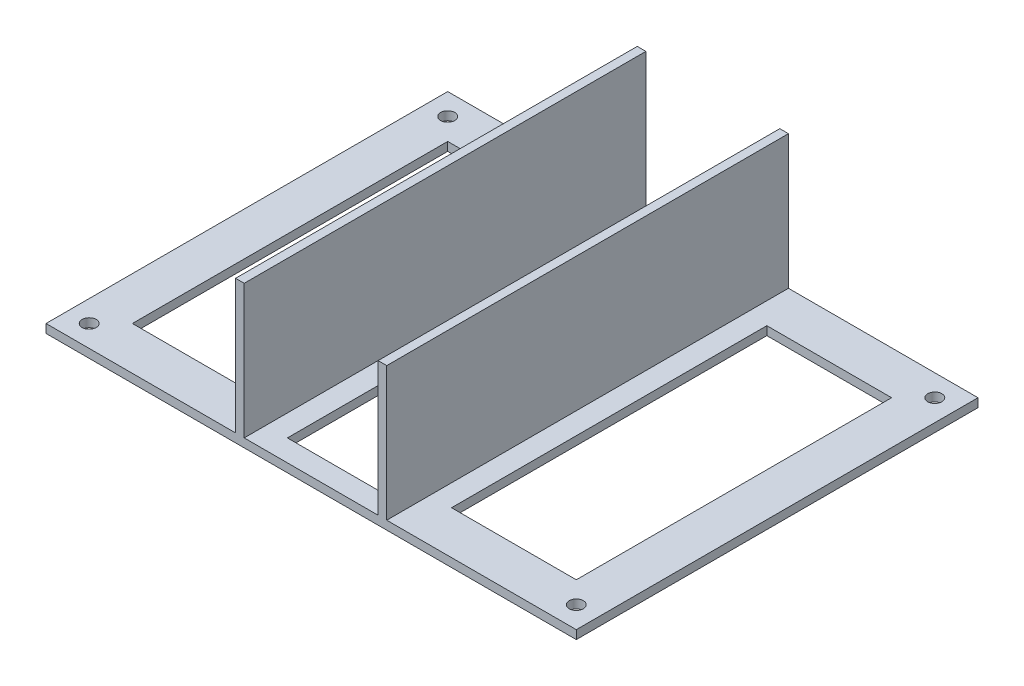
ISO-10303-21;
HEADER;
FILE_DESCRIPTION(('STEP AP214'),'2;1');
FILE_NAME('part.step','',(''),(''),'','','');
FILE_SCHEMA(('AUTOMOTIVE_DESIGN { 1 0 10303 214 1 1 1 1 }'));
ENDSEC;
DATA;
#1=APPLICATION_CONTEXT('core data for automotive mechanical design processes');
#2=APPLICATION_PROTOCOL_DEFINITION('international standard','automotive_design',2000,#1);
#3=PRODUCT_CONTEXT('',#1,'mechanical');
#4=PRODUCT('Part','Part','',(#3));
#5=PRODUCT_RELATED_PRODUCT_CATEGORY('part','',(#4));
#6=PRODUCT_DEFINITION_FORMATION('','',#4);
#7=PRODUCT_DEFINITION_CONTEXT('part definition',#1,'design');
#8=PRODUCT_DEFINITION('design','',#6,#7);
#9=PRODUCT_DEFINITION_SHAPE('','',#8);
#10=(LENGTH_UNIT() NAMED_UNIT(*) SI_UNIT(.MILLI.,.METRE.));
#11=(NAMED_UNIT(*) PLANE_ANGLE_UNIT() SI_UNIT($,.RADIAN.));
#12=(NAMED_UNIT(*) SI_UNIT($,.STERADIAN.) SOLID_ANGLE_UNIT());
#13=UNCERTAINTY_MEASURE_WITH_UNIT(LENGTH_MEASURE(1.E-05),#10,'distance_accuracy_value','');
#14=(GEOMETRIC_REPRESENTATION_CONTEXT(3) GLOBAL_UNCERTAINTY_ASSIGNED_CONTEXT((#13)) GLOBAL_UNIT_ASSIGNED_CONTEXT((#10,
#11,#12)) REPRESENTATION_CONTEXT('',''));
#15=CARTESIAN_POINT('',(0.,0.,0.));
#16=DIRECTION('',(0.,0.,1.));
#17=DIRECTION('',(1.,0.,0.));
#18=AXIS2_PLACEMENT_3D('',#15,#16,#17);
#19=CARTESIAN_POINT('',(0.,2.,0.));
#20=DIRECTION('',(0.,1.,0.));
#21=DIRECTION('',(0.,0.,1.));
#22=AXIS2_PLACEMENT_3D('',#19,#20,#21);
#23=PLANE('',#22);
#24=DIRECTION('',(0.,0.,-1.));
#25=VECTOR('',#24,1.);
#26=CARTESIAN_POINT('',(-94.8713787260503,2.,-41.858527933184));
#27=LINE('',#26,#25);
#28=CARTESIAN_POINT('',(-94.8713787260502,2.,41.141472066816));
#29=VERTEX_POINT('',#28);
#30=CARTESIAN_POINT('',(-94.8713787260503,2.,-41.858527933184));
#31=VERTEX_POINT('',#30);
#32=EDGE_CURVE('E52',#29,#31,#27,.T.);
#33=ORIENTED_EDGE('',*,*,#32,.F.);
#34=DIRECTION('',(1.,0.,0.));
#35=VECTOR('',#34,1.);
#36=CARTESIAN_POINT('',(-94.8713787260502,2.,41.141472066816));
#37=LINE('',#36,#35);
#38=CARTESIAN_POINT('',(-115.87137872605,2.,41.141472066816));
#39=VERTEX_POINT('',#38);
#40=EDGE_CURVE('E246',#39,#29,#37,.T.);
#41=ORIENTED_EDGE('',*,*,#40,.F.);
#42=DIRECTION('',(0.,0.,1.));
#43=VECTOR('',#42,1.);
#44=CARTESIAN_POINT('',(-115.87137872605,2.,-41.858527933184));
#45=LINE('',#44,#43);
#46=CARTESIAN_POINT('',(-115.87137872605,2.,-41.858527933184));
#47=VERTEX_POINT('',#46);
#48=EDGE_CURVE('E261',#47,#39,#45,.T.);
#49=ORIENTED_EDGE('',*,*,#48,.F.);
#50=DIRECTION('',(-1.,0.,0.));
#51=VECTOR('',#50,1.);
#52=CARTESIAN_POINT('',(-94.8713787260503,2.,-41.858527933184));
#53=LINE('',#52,#51);
#54=EDGE_CURVE('E257',#31,#47,#53,.T.);
#55=ORIENTED_EDGE('',*,*,#54,.F.);
#56=EDGE_LOOP('',(#33,#41,#49,#55));
#57=FACE_BOUND('',#56,.T.);
#58=DIRECTION('',(1.,0.,0.));
#59=VECTOR('',#58,1.);
#60=CARTESIAN_POINT('',(0.,2.,46.141472066816));
#61=LINE('',#60,#59);
#62=CARTESIAN_POINT('',(-120.87137872605,2.,46.141472066816));
#63=VERTEX_POINT('',#62);
#64=CARTESIAN_POINT('',(-89.8713787260503,2.,46.141472066816));
#65=VERTEX_POINT('',#64);
#66=EDGE_CURVE('E385',#63,#65,#61,.T.);
#67=ORIENTED_EDGE('',*,*,#66,.T.);
#68=DIRECTION('',(0.,0.,1.));
#69=VECTOR('',#68,1.);
#70=CARTESIAN_POINT('',(-89.8713787260503,2.,-46.858527933184));
#71=LINE('',#70,#69);
#72=CARTESIAN_POINT('',(-89.8713787260503,2.,-46.858527933184));
#73=VERTEX_POINT('',#72);
#74=EDGE_CURVE('E316',#73,#65,#71,.T.);
#75=ORIENTED_EDGE('',*,*,#74,.F.);
#76=DIRECTION('',(1.,0.,0.));
#77=VECTOR('',#76,1.);
#78=CARTESIAN_POINT('',(0.,2.,-46.858527933184));
#79=LINE('',#78,#77);
#80=CARTESIAN_POINT('',(-120.87137872605,2.,-46.858527933184));
#81=VERTEX_POINT('',#80);
#82=EDGE_CURVE('E378',#81,#73,#79,.T.);
#83=ORIENTED_EDGE('',*,*,#82,.F.);
#84=DIRECTION('',(0.,0.,-1.));
#85=VECTOR('',#84,1.);
#86=CARTESIAN_POINT('',(-120.87137872605,2.,0.));
#87=LINE('',#86,#85);
#88=EDGE_CURVE('E334',#63,#81,#87,.T.);
#89=ORIENTED_EDGE('',*,*,#88,.F.);
#90=EDGE_LOOP('',(#67,#75,#83,#89));
#91=FACE_BOUND('',#90,.T.);
#92=ADVANCED_FACE('F37',(#57,#91),#23,.T.);
#93=DIRECTION('',(0.,0.,1.));
#94=VECTOR('',#93,1.);
#95=CARTESIAN_POINT('',(-82.8713787260502,2.,-36.858527933184));
#96=LINE('',#95,#94);
#97=CARTESIAN_POINT('',(-82.8713787260502,2.,-36.858527933184));
#98=VERTEX_POINT('',#97);
#99=CARTESIAN_POINT('',(-82.8713787260502,2.,36.141472066816));
#100=VERTEX_POINT('',#99);
#101=EDGE_CURVE('E60',#98,#100,#96,.T.);
#102=ORIENTED_EDGE('',*,*,#101,.F.);
#103=DIRECTION('',(-1.,0.,0.));
#104=VECTOR('',#103,1.);
#105=CARTESIAN_POINT('',(-82.8713787260502,2.,-36.858527933184));
#106=LINE('',#105,#104);
#107=CARTESIAN_POINT('',(-53.9863787260503,2.,-36.858527933184));
#108=VERTEX_POINT('',#107);
#109=EDGE_CURVE('E276',#108,#98,#106,.T.);
#110=ORIENTED_EDGE('',*,*,#109,.F.);
#111=DIRECTION('',(0.,0.,-1.));
#112=VECTOR('',#111,1.);
#113=CARTESIAN_POINT('',(-53.9863787260503,2.,-36.858527933184));
#114=LINE('',#113,#112);
#115=CARTESIAN_POINT('',(-53.9863787260503,2.,36.141472066816));
#116=VERTEX_POINT('',#115);
#117=EDGE_CURVE('E290',#116,#108,#114,.T.);
#118=ORIENTED_EDGE('',*,*,#117,.F.);
#119=DIRECTION('',(1.,0.,0.));
#120=VECTOR('',#119,1.);
#121=CARTESIAN_POINT('',(-82.8713787260502,2.,36.141472066816));
#122=LINE('',#121,#120);
#123=EDGE_CURVE('E287',#100,#116,#122,.T.);
#124=ORIENTED_EDGE('',*,*,#123,.F.);
#125=EDGE_LOOP('',(#102,#110,#118,#124));
#126=FACE_BOUND('',#125,.T.);
#127=DIRECTION('',(0.,0.,1.));
#128=VECTOR('',#127,1.);
#129=CARTESIAN_POINT('',(-87.8713787260502,2.,-46.858527933184));
#130=LINE('',#129,#128);
#131=CARTESIAN_POINT('',(-87.8713787260502,2.,-46.858527933184));
#132=VERTEX_POINT('',#131);
#133=CARTESIAN_POINT('',(-87.8713787260502,2.,46.141472066816));
#134=VERTEX_POINT('',#133);
#135=EDGE_CURVE('E313',#132,#134,#130,.T.);
#136=ORIENTED_EDGE('',*,*,#135,.T.);
#137=CARTESIAN_POINT('',(-43.9863787260503,2.,46.141472066816));
#138=VERTEX_POINT('',#137);
#139=EDGE_CURVE('E381',#134,#138,#61,.T.);
#140=ORIENTED_EDGE('',*,*,#139,.T.);
#141=DIRECTION('',(0.,0.,1.));
#142=VECTOR('',#141,1.);
#143=CARTESIAN_POINT('',(-43.9863787260503,2.,0.));
#144=LINE('',#143,#142);
#145=CARTESIAN_POINT('',(-43.9863787260503,2.,-46.858527933184));
#146=VERTEX_POINT('',#145);
#147=EDGE_CURVE('E370',#146,#138,#144,.T.);
#148=ORIENTED_EDGE('',*,*,#147,.F.);
#149=EDGE_CURVE('E373',#132,#146,#79,.T.);
#150=ORIENTED_EDGE('',*,*,#149,.F.);
#151=EDGE_LOOP('',(#136,#140,#148,#150));
#152=FACE_BOUND('',#151,.T.);
#153=CARTESIAN_POINT('',(-48.9863787260503,2.,41.141472066816));
#154=DIRECTION('',(0.,1.,0.));
#155=DIRECTION('',(0.,0.,1.));
#156=AXIS2_PLACEMENT_3D('',#153,#154,#155);
#157=CIRCLE('',#156,1.63);
#158=CARTESIAN_POINT('',(-48.9863787260503,2.,42.771472066816));
#159=VERTEX_POINT('',#158);
#160=EDGE_CURVE('E364',#159,#159,#157,.T.);
#161=ORIENTED_EDGE('',*,*,#160,.F.);
#162=EDGE_LOOP('',(#161));
#163=FACE_BOUND('',#162,.T.);
#164=CARTESIAN_POINT('',(-48.9863787260503,2.,-41.858527933184));
#165=DIRECTION('',(0.,1.,0.));
#166=DIRECTION('',(0.,0.,1.));
#167=AXIS2_PLACEMENT_3D('',#164,#165,#166);
#168=CIRCLE('',#167,1.63);
#169=CARTESIAN_POINT('',(-48.9863787260503,2.,-40.228527933184));
#170=VERTEX_POINT('',#169);
#171=EDGE_CURVE('E360',#170,#170,#168,.T.);
#172=ORIENTED_EDGE('',*,*,#171,.F.);
#173=EDGE_LOOP('',(#172));
#174=FACE_BOUND('',#173,.T.);
#175=ADVANCED_FACE('F450',(#126,#152,#163,#174),#23,.T.);
#176=CARTESIAN_POINT('',(-43.9863787260503,2.,0.));
#177=DIRECTION('',(1.,0.,0.));
#178=DIRECTION('',(0.,0.,-1.));
#179=AXIS2_PLACEMENT_3D('',#176,#177,#178);
#180=PLANE('',#179);
#181=DIRECTION('',(0.,0.,1.));
#182=VECTOR('',#181,1.);
#183=CARTESIAN_POINT('',(-43.9863787260503,0.,0.));
#184=LINE('',#183,#182);
#185=CARTESIAN_POINT('',(-43.9863787260503,0.,-46.858527933184));
#186=VERTEX_POINT('',#185);
#187=CARTESIAN_POINT('',(-43.9863787260503,0.,46.141472066816));
#188=VERTEX_POINT('',#187);
#189=EDGE_CURVE('E397',#186,#188,#184,.T.);
#190=ORIENTED_EDGE('',*,*,#189,.F.);
#191=DIRECTION('',(0.,-1.,0.));
#192=VECTOR('',#191,1.);
#193=CARTESIAN_POINT('',(-43.9863787260503,2.,-46.858527933184));
#194=LINE('',#193,#192);
#195=EDGE_CURVE('E11',#146,#186,#194,.T.);
#196=ORIENTED_EDGE('',*,*,#195,.F.);
#197=ORIENTED_EDGE('',*,*,#147,.T.);
#198=DIRECTION('',(0.,-1.,0.));
#199=VECTOR('',#198,1.);
#200=CARTESIAN_POINT('',(-43.9863787260503,2.,46.141472066816));
#201=LINE('',#200,#199);
#202=EDGE_CURVE('E384',#138,#188,#201,.T.);
#203=ORIENTED_EDGE('',*,*,#202,.T.);
#204=EDGE_LOOP('',(#190,#196,#197,#203));
#205=FACE_BOUND('',#204,.T.);
#206=ADVANCED_FACE('F425',(#205),#180,.T.);
#207=CARTESIAN_POINT('',(0.,2.,-46.858527933184));
#208=DIRECTION('',(0.,0.,-1.));
#209=DIRECTION('',(-1.,0.,0.));
#210=AXIS2_PLACEMENT_3D('',#207,#208,#209);
#211=PLANE('',#210);
#212=DIRECTION('',(1.,0.,0.));
#213=VECTOR('',#212,1.);
#214=CARTESIAN_POINT('',(0.,0.,-46.858527933184));
#215=LINE('',#214,#213);
#216=CARTESIAN_POINT('',(-166.75637872605,0.,-46.858527933184));
#217=VERTEX_POINT('',#216);
#218=EDGE_CURVE('E400',#217,#186,#215,.T.);
#219=ORIENTED_EDGE('',*,*,#218,.F.);
#220=DIRECTION('',(0.,-1.,0.));
#221=VECTOR('',#220,1.);
#222=CARTESIAN_POINT('',(-166.75637872605,2.,-46.858527933184));
#223=LINE('',#222,#221);
#224=CARTESIAN_POINT('',(-166.75637872605,2.,-46.858527933184));
#225=VERTEX_POINT('',#224);
#226=EDGE_CURVE('E45',#225,#217,#223,.T.);
#227=ORIENTED_EDGE('',*,*,#226,.F.);
#228=CARTESIAN_POINT('',(-122.87137872605,2.,-46.858527933184));
#229=VERTEX_POINT('',#228);
#230=EDGE_CURVE('E374',#225,#229,#79,.T.);
#231=ORIENTED_EDGE('',*,*,#230,.T.);
#232=DIRECTION('',(0.,-1.,0.));
#233=VECTOR('',#232,1.);
#234=CARTESIAN_POINT('',(-122.87137872605,33.,-46.858527933184));
#235=LINE('',#234,#233);
#236=CARTESIAN_POINT('',(-122.87137872605,33.,-46.858527933184));
#237=VERTEX_POINT('',#236);
#238=EDGE_CURVE('E353',#237,#229,#235,.T.);
#239=ORIENTED_EDGE('',*,*,#238,.F.);
#240=DIRECTION('',(-1.,0.,0.));
#241=VECTOR('',#240,1.);
#242=CARTESIAN_POINT('',(0.,33.,-46.858527933184));
#243=LINE('',#242,#241);
#244=CARTESIAN_POINT('',(-120.87137872605,33.,-46.858527933184));
#245=VERTEX_POINT('',#244);
#246=EDGE_CURVE('E330',#245,#237,#243,.T.);
#247=ORIENTED_EDGE('',*,*,#246,.F.);
#248=DIRECTION('',(0.,-1.,0.));
#249=VECTOR('',#248,1.);
#250=CARTESIAN_POINT('',(-120.87137872605,33.,-46.858527933184));
#251=LINE('',#250,#249);
#252=EDGE_CURVE('E340',#245,#81,#251,.T.);
#253=ORIENTED_EDGE('',*,*,#252,.T.);
#254=ORIENTED_EDGE('',*,*,#82,.T.);
#255=DIRECTION('',(0.,-1.,0.));
#256=VECTOR('',#255,1.);
#257=CARTESIAN_POINT('',(-89.8713787260503,33.,-46.858527933184));
#258=LINE('',#257,#256);
#259=CARTESIAN_POINT('',(-89.8713787260503,33.,-46.858527933184));
#260=VERTEX_POINT('',#259);
#261=EDGE_CURVE('E309',#260,#73,#258,.T.);
#262=ORIENTED_EDGE('',*,*,#261,.F.);
#263=DIRECTION('',(1.,0.,0.));
#264=VECTOR('',#263,1.);
#265=CARTESIAN_POINT('',(-89.8713787260503,33.,-46.858527933184));
#266=LINE('',#265,#264);
#267=CARTESIAN_POINT('',(-87.8713787260502,33.,-46.858527933184));
#268=VERTEX_POINT('',#267);
#269=EDGE_CURVE('E312',#260,#268,#266,.T.);
#270=ORIENTED_EDGE('',*,*,#269,.T.);
#271=DIRECTION('',(0.,-1.,0.));
#272=VECTOR('',#271,1.);
#273=CARTESIAN_POINT('',(-87.8713787260502,33.,-46.858527933184));
#274=LINE('',#273,#272);
#275=EDGE_CURVE('E306',#268,#132,#274,.T.);
#276=ORIENTED_EDGE('',*,*,#275,.T.);
#277=ORIENTED_EDGE('',*,*,#149,.T.);
#278=ORIENTED_EDGE('',*,*,#195,.T.);
#279=EDGE_LOOP('',(#219,#227,#231,#239,#247,#253,#254,#262,#270,#276,#277,#278));
#280=FACE_BOUND('',#279,.T.);
#281=ADVANCED_FACE('F420',(#280),#211,.T.);
#282=CARTESIAN_POINT('',(-166.75637872605,2.,0.));
#283=DIRECTION('',(1.,0.,0.));
#284=DIRECTION('',(0.,0.,-1.));
#285=AXIS2_PLACEMENT_3D('',#282,#283,#284);
#286=PLANE('',#285);
#287=DIRECTION('',(0.,0.,1.));
#288=VECTOR('',#287,1.);
#289=CARTESIAN_POINT('',(-166.75637872605,0.,0.));
#290=LINE('',#289,#288);
#291=CARTESIAN_POINT('',(-166.75637872605,0.,46.141472066816));
#292=VERTEX_POINT('',#291);
#293=EDGE_CURVE('E403',#217,#292,#290,.T.);
#294=ORIENTED_EDGE('',*,*,#293,.T.);
#295=DIRECTION('',(0.,-1.,0.));
#296=VECTOR('',#295,1.);
#297=CARTESIAN_POINT('',(-166.75637872605,2.,46.141472066816));
#298=LINE('',#297,#296);
#299=CARTESIAN_POINT('',(-166.75637872605,2.,46.141472066816));
#300=VERTEX_POINT('',#299);
#301=EDGE_CURVE('E409',#300,#292,#298,.T.);
#302=ORIENTED_EDGE('',*,*,#301,.F.);
#303=DIRECTION('',(0.,0.,1.));
#304=VECTOR('',#303,1.);
#305=CARTESIAN_POINT('',(-166.75637872605,2.,0.));
#306=LINE('',#305,#304);
#307=EDGE_CURVE('E377',#225,#300,#306,.T.);
#308=ORIENTED_EDGE('',*,*,#307,.F.);
#309=ORIENTED_EDGE('',*,*,#226,.T.);
#310=EDGE_LOOP('',(#294,#302,#308,#309));
#311=FACE_BOUND('',#310,.T.);
#312=ADVANCED_FACE('F414',(#311),#286,.F.);
#313=CARTESIAN_POINT('',(-161.75637872605,2.,-41.858527933184));
#314=DIRECTION('',(0.,-1.,0.));
#315=DIRECTION('',(0.,0.,-1.));
#316=AXIS2_PLACEMENT_3D('',#313,#314,#315);
#317=CYLINDRICAL_SURFACE('',#316,1.62999999999999);
#318=CARTESIAN_POINT('',(-161.75637872605,2.,-41.858527933184));
#319=DIRECTION('',(0.,1.,0.));
#320=DIRECTION('',(0.,0.,1.));
#321=AXIS2_PLACEMENT_3D('',#318,#319,#320);
#322=CIRCLE('',#321,1.62999999999999);
#323=CARTESIAN_POINT('',(-161.75637872605,2.,-40.228527933184));
#324=VERTEX_POINT('',#323);
#325=EDGE_CURVE('E367',#324,#324,#322,.T.);
#326=ORIENTED_EDGE('',*,*,#325,.T.);
#327=EDGE_LOOP('',(#326));
#328=FACE_BOUND('',#327,.T.);
#329=CARTESIAN_POINT('',(-161.75637872605,0.,-41.858527933184));
#330=DIRECTION('',(0.,1.,0.));
#331=DIRECTION('',(0.,0.,1.));
#332=AXIS2_PLACEMENT_3D('',#329,#330,#331);
#333=CIRCLE('',#332,1.62999999999999);
#334=CARTESIAN_POINT('',(-161.75637872605,0.,-40.228527933184));
#335=VERTEX_POINT('',#334);
#336=EDGE_CURVE('E394',#335,#335,#333,.T.);
#337=ORIENTED_EDGE('',*,*,#336,.F.);
#338=EDGE_LOOP('',(#337));
#339=FACE_BOUND('',#338,.T.);
#340=ADVANCED_FACE('F730',(#328,#339),#317,.F.);
#341=CARTESIAN_POINT('',(-48.9863787260503,2.,41.141472066816));
#342=DIRECTION('',(0.,-1.,0.));
#343=DIRECTION('',(0.,0.,-1.));
#344=AXIS2_PLACEMENT_3D('',#341,#342,#343);
#345=CYLINDRICAL_SURFACE('',#344,1.63);
#346=ORIENTED_EDGE('',*,*,#160,.T.);
#347=EDGE_LOOP('',(#346));
#348=FACE_BOUND('',#347,.T.);
#349=CARTESIAN_POINT('',(-48.9863787260503,0.,41.141472066816));
#350=DIRECTION('',(0.,1.,0.));
#351=DIRECTION('',(0.,0.,1.));
#352=AXIS2_PLACEMENT_3D('',#349,#350,#351);
#353=CIRCLE('',#352,1.63);
#354=CARTESIAN_POINT('',(-48.9863787260503,0.,42.771472066816));
#355=VERTEX_POINT('',#354);
#356=EDGE_CURVE('E391',#355,#355,#353,.T.);
#357=ORIENTED_EDGE('',*,*,#356,.F.);
#358=EDGE_LOOP('',(#357));
#359=FACE_BOUND('',#358,.T.);
#360=ADVANCED_FACE('F722',(#348,#359),#345,.F.);
#361=CARTESIAN_POINT('',(-48.9863787260503,2.,-41.858527933184));
#362=DIRECTION('',(0.,-1.,0.));
#363=DIRECTION('',(0.,0.,-1.));
#364=AXIS2_PLACEMENT_3D('',#361,#362,#363);
#365=CYLINDRICAL_SURFACE('',#364,1.63);
#366=ORIENTED_EDGE('',*,*,#171,.T.);
#367=EDGE_LOOP('',(#366));
#368=FACE_BOUND('',#367,.T.);
#369=CARTESIAN_POINT('',(-48.9863787260503,0.,-41.858527933184));
#370=DIRECTION('',(0.,1.,0.));
#371=DIRECTION('',(0.,0.,1.));
#372=AXIS2_PLACEMENT_3D('',#369,#370,#371);
#373=CIRCLE('',#372,1.63);
#374=CARTESIAN_POINT('',(-48.9863787260503,0.,-40.228527933184));
#375=VERTEX_POINT('',#374);
#376=EDGE_CURVE('E388',#375,#375,#373,.T.);
#377=ORIENTED_EDGE('',*,*,#376,.F.);
#378=EDGE_LOOP('',(#377));
#379=FACE_BOUND('',#378,.T.);
#380=ADVANCED_FACE('F713',(#368,#379),#365,.F.);
#381=CARTESIAN_POINT('',(-161.75637872605,2.,41.141472066816));
#382=DIRECTION('',(0.,-1.,0.));
#383=DIRECTION('',(0.,0.,-1.));
#384=AXIS2_PLACEMENT_3D('',#381,#382,#383);
#385=CYLINDRICAL_SURFACE('',#384,1.62999999999999);
#386=CARTESIAN_POINT('',(-161.75637872605,2.,41.141472066816));
#387=DIRECTION('',(0.,1.,0.));
#388=DIRECTION('',(0.,0.,1.));
#389=AXIS2_PLACEMENT_3D('',#386,#387,#388);
#390=CIRCLE('',#389,1.62999999999999);
#391=CARTESIAN_POINT('',(-161.75637872605,2.,42.771472066816));
#392=VERTEX_POINT('',#391);
#393=EDGE_CURVE('E357',#392,#392,#390,.T.);
#394=ORIENTED_EDGE('',*,*,#393,.T.);
#395=EDGE_LOOP('',(#394));
#396=FACE_BOUND('',#395,.T.);
#397=CARTESIAN_POINT('',(-161.75637872605,0.,41.141472066816));
#398=DIRECTION('',(0.,1.,0.));
#399=DIRECTION('',(0.,0.,1.));
#400=AXIS2_PLACEMENT_3D('',#397,#398,#399);
#401=CIRCLE('',#400,1.62999999999999);
#402=CARTESIAN_POINT('',(-161.75637872605,0.,42.771472066816));
#403=VERTEX_POINT('',#402);
#404=EDGE_CURVE('E356',#403,#403,#401,.T.);
#405=ORIENTED_EDGE('',*,*,#404,.F.);
#406=EDGE_LOOP('',(#405));
#407=FACE_BOUND('',#406,.T.);
#408=ADVANCED_FACE('F39',(#396,#407),#385,.F.);
#409=CARTESIAN_POINT('',(0.,2.,46.141472066816));
#410=DIRECTION('',(0.,0.,-1.));
#411=DIRECTION('',(-1.,0.,0.));
#412=AXIS2_PLACEMENT_3D('',#409,#410,#411);
#413=PLANE('',#412);
#414=DIRECTION('',(1.,0.,0.));
#415=VECTOR('',#414,1.);
#416=CARTESIAN_POINT('',(0.,0.,46.141472066816));
#417=LINE('',#416,#415);
#418=EDGE_CURVE('E361',#292,#188,#417,.T.);
#419=ORIENTED_EDGE('',*,*,#418,.T.);
#420=ORIENTED_EDGE('',*,*,#202,.F.);
#421=ORIENTED_EDGE('',*,*,#139,.F.);
#422=DIRECTION('',(0.,-1.,0.));
#423=VECTOR('',#422,1.);
#424=CARTESIAN_POINT('',(-87.8713787260502,33.,46.141472066816));
#425=LINE('',#424,#423);
#426=CARTESIAN_POINT('',(-87.8713787260502,33.,46.141472066816));
#427=VERTEX_POINT('',#426);
#428=EDGE_CURVE('E303',#427,#134,#425,.T.);
#429=ORIENTED_EDGE('',*,*,#428,.F.);
#430=DIRECTION('',(1.,0.,0.));
#431=VECTOR('',#430,1.);
#432=CARTESIAN_POINT('',(-89.8713787260502,33.,46.141472066816));
#433=LINE('',#432,#431);
#434=CARTESIAN_POINT('',(-89.8713787260502,33.,46.141472066816));
#435=VERTEX_POINT('',#434);
#436=EDGE_CURVE('E326',#435,#427,#433,.T.);
#437=ORIENTED_EDGE('',*,*,#436,.F.);
#438=DIRECTION('',(0.,-1.,0.));
#439=VECTOR('',#438,1.);
#440=CARTESIAN_POINT('',(-89.8713787260502,33.,46.141472066816));
#441=LINE('',#440,#439);
#442=EDGE_CURVE('E238',#435,#65,#441,.T.);
#443=ORIENTED_EDGE('',*,*,#442,.T.);
#444=ORIENTED_EDGE('',*,*,#66,.F.);
#445=DIRECTION('',(0.,-1.,0.));
#446=VECTOR('',#445,1.);
#447=CARTESIAN_POINT('',(-120.87137872605,33.,46.141472066816));
#448=LINE('',#447,#446);
#449=CARTESIAN_POINT('',(-120.87137872605,33.,46.141472066816));
#450=VERTEX_POINT('',#449);
#451=EDGE_CURVE('E347',#450,#63,#448,.T.);
#452=ORIENTED_EDGE('',*,*,#451,.F.);
#453=DIRECTION('',(1.,0.,0.));
#454=VECTOR('',#453,1.);
#455=CARTESIAN_POINT('',(0.,33.,46.141472066816));
#456=LINE('',#455,#454);
#457=CARTESIAN_POINT('',(-122.87137872605,33.,46.141472066816));
#458=VERTEX_POINT('',#457);
#459=EDGE_CURVE('E336',#458,#450,#456,.T.);
#460=ORIENTED_EDGE('',*,*,#459,.F.);
#461=DIRECTION('',(0.,-1.,0.));
#462=VECTOR('',#461,1.);
#463=CARTESIAN_POINT('',(-122.87137872605,33.,46.141472066816));
#464=LINE('',#463,#462);
#465=CARTESIAN_POINT('',(-122.87137872605,2.,46.141472066816));
#466=VERTEX_POINT('',#465);
#467=EDGE_CURVE('E350',#458,#466,#464,.T.);
#468=ORIENTED_EDGE('',*,*,#467,.T.);
#469=EDGE_CURVE('E382',#300,#466,#61,.T.);
#470=ORIENTED_EDGE('',*,*,#469,.F.);
#471=ORIENTED_EDGE('',*,*,#301,.T.);
#472=EDGE_LOOP('',(#419,#420,#421,#429,#437,#443,#444,#452,#460,#468,#470,#471));
#473=FACE_BOUND('',#472,.T.);
#474=ADVANCED_FACE('F428',(#473),#413,.F.);
#475=DIRECTION('',(0.,0.,1.));
#476=VECTOR('',#475,1.);
#477=CARTESIAN_POINT('',(-156.75637872605,2.,-36.858527933184));
#478=LINE('',#477,#476);
#479=CARTESIAN_POINT('',(-156.75637872605,2.,-36.858527933184));
#480=VERTEX_POINT('',#479);
#481=CARTESIAN_POINT('',(-156.75637872605,2.,36.141472066816));
#482=VERTEX_POINT('',#481);
#483=EDGE_CURVE('E204',#480,#482,#478,.T.);
#484=ORIENTED_EDGE('',*,*,#483,.F.);
#485=DIRECTION('',(-1.,0.,0.));
#486=VECTOR('',#485,1.);
#487=CARTESIAN_POINT('',(-156.75637872605,2.,-36.858527933184));
#488=LINE('',#487,#486);
#489=CARTESIAN_POINT('',(-127.87137872605,2.,-36.858527933184));
#490=VERTEX_POINT('',#489);
#491=EDGE_CURVE('E222',#490,#480,#488,.T.);
#492=ORIENTED_EDGE('',*,*,#491,.F.);
#493=DIRECTION('',(0.,0.,-1.));
#494=VECTOR('',#493,1.);
#495=CARTESIAN_POINT('',(-127.87137872605,2.,-36.858527933184));
#496=LINE('',#495,#494);
#497=CARTESIAN_POINT('',(-127.87137872605,2.,36.141472066816));
#498=VERTEX_POINT('',#497);
#499=EDGE_CURVE('E225',#498,#490,#496,.T.);
#500=ORIENTED_EDGE('',*,*,#499,.F.);
#501=DIRECTION('',(1.,0.,0.));
#502=VECTOR('',#501,1.);
#503=CARTESIAN_POINT('',(-156.75637872605,2.,36.141472066816));
#504=LINE('',#503,#502);
#505=EDGE_CURVE('E231',#482,#498,#504,.T.);
#506=ORIENTED_EDGE('',*,*,#505,.F.);
#507=EDGE_LOOP('',(#484,#492,#500,#506));
#508=FACE_BOUND('',#507,.T.);
#509=DIRECTION('',(0.,0.,1.));
#510=VECTOR('',#509,1.);
#511=CARTESIAN_POINT('',(-122.87137872605,2.,0.));
#512=LINE('',#511,#510);
#513=EDGE_CURVE('E320',#229,#466,#512,.T.);
#514=ORIENTED_EDGE('',*,*,#513,.F.);
#515=ORIENTED_EDGE('',*,*,#230,.F.);
#516=ORIENTED_EDGE('',*,*,#307,.T.);
#517=ORIENTED_EDGE('',*,*,#469,.T.);
#518=EDGE_LOOP('',(#514,#515,#516,#517));
#519=FACE_BOUND('',#518,.T.);
#520=ORIENTED_EDGE('',*,*,#393,.F.);
#521=EDGE_LOOP('',(#520));
#522=FACE_BOUND('',#521,.T.);
#523=ORIENTED_EDGE('',*,*,#325,.F.);
#524=EDGE_LOOP('',(#523));
#525=FACE_BOUND('',#524,.T.);
#526=ADVANCED_FACE('F432',(#508,#519,#522,#525),#23,.T.);
#527=CARTESIAN_POINT('',(0.,0.,0.));
#528=DIRECTION('',(0.,1.,0.));
#529=DIRECTION('',(0.,0.,1.));
#530=AXIS2_PLACEMENT_3D('',#527,#528,#529);
#531=PLANE('',#530);
#532=DIRECTION('',(-1.,0.,0.));
#533=VECTOR('',#532,1.);
#534=CARTESIAN_POINT('',(-156.75637872605,0.,-36.858527933184));
#535=LINE('',#534,#533);
#536=CARTESIAN_POINT('',(-127.87137872605,0.,-36.858527933184));
#537=VERTEX_POINT('',#536);
#538=CARTESIAN_POINT('',(-156.75637872605,0.,-36.858527933184));
#539=VERTEX_POINT('',#538);
#540=EDGE_CURVE('E209',#537,#539,#535,.T.);
#541=ORIENTED_EDGE('',*,*,#540,.T.);
#542=DIRECTION('',(0.,0.,1.));
#543=VECTOR('',#542,1.);
#544=CARTESIAN_POINT('',(-156.75637872605,0.,-36.858527933184));
#545=LINE('',#544,#543);
#546=CARTESIAN_POINT('',(-156.75637872605,0.,36.141472066816));
#547=VERTEX_POINT('',#546);
#548=EDGE_CURVE('E201',#539,#547,#545,.T.);
#549=ORIENTED_EDGE('',*,*,#548,.T.);
#550=DIRECTION('',(1.,0.,0.));
#551=VECTOR('',#550,1.);
#552=CARTESIAN_POINT('',(-156.75637872605,0.,36.141472066816));
#553=LINE('',#552,#551);
#554=CARTESIAN_POINT('',(-127.87137872605,0.,36.141472066816));
#555=VERTEX_POINT('',#554);
#556=EDGE_CURVE('E213',#547,#555,#553,.T.);
#557=ORIENTED_EDGE('',*,*,#556,.T.);
#558=DIRECTION('',(0.,0.,-1.));
#559=VECTOR('',#558,1.);
#560=CARTESIAN_POINT('',(-127.87137872605,0.,-36.858527933184));
#561=LINE('',#560,#559);
#562=EDGE_CURVE('E217',#555,#537,#561,.T.);
#563=ORIENTED_EDGE('',*,*,#562,.T.);
#564=EDGE_LOOP('',(#541,#549,#557,#563));
#565=FACE_BOUND('',#564,.T.);
#566=DIRECTION('',(1.,0.,0.));
#567=VECTOR('',#566,1.);
#568=CARTESIAN_POINT('',(-94.8713787260502,0.,41.141472066816));
#569=LINE('',#568,#567);
#570=CARTESIAN_POINT('',(-115.87137872605,0.,41.141472066816));
#571=VERTEX_POINT('',#570);
#572=CARTESIAN_POINT('',(-94.8713787260502,0.,41.141472066816));
#573=VERTEX_POINT('',#572);
#574=EDGE_CURVE('E252',#571,#573,#569,.T.);
#575=ORIENTED_EDGE('',*,*,#574,.T.);
#576=DIRECTION('',(0.,0.,-1.));
#577=VECTOR('',#576,1.);
#578=CARTESIAN_POINT('',(-94.8713787260503,0.,-41.858527933184));
#579=LINE('',#578,#577);
#580=CARTESIAN_POINT('',(-94.8713787260503,0.,-41.858527933184));
#581=VERTEX_POINT('',#580);
#582=EDGE_CURVE('E242',#573,#581,#579,.T.);
#583=ORIENTED_EDGE('',*,*,#582,.T.);
#584=DIRECTION('',(-1.,0.,0.));
#585=VECTOR('',#584,1.);
#586=CARTESIAN_POINT('',(-94.8713787260503,0.,-41.858527933184));
#587=LINE('',#586,#585);
#588=CARTESIAN_POINT('',(-115.87137872605,0.,-41.858527933184));
#589=VERTEX_POINT('',#588);
#590=EDGE_CURVE('E245',#581,#589,#587,.T.);
#591=ORIENTED_EDGE('',*,*,#590,.T.);
#592=DIRECTION('',(0.,0.,1.));
#593=VECTOR('',#592,1.);
#594=CARTESIAN_POINT('',(-115.87137872605,0.,-41.858527933184));
#595=LINE('',#594,#593);
#596=EDGE_CURVE('E249',#589,#571,#595,.T.);
#597=ORIENTED_EDGE('',*,*,#596,.T.);
#598=EDGE_LOOP('',(#575,#583,#591,#597));
#599=FACE_BOUND('',#598,.T.);
#600=DIRECTION('',(-1.,0.,0.));
#601=VECTOR('',#600,1.);
#602=CARTESIAN_POINT('',(-82.8713787260502,0.,-36.858527933184));
#603=LINE('',#602,#601);
#604=CARTESIAN_POINT('',(-53.9863787260503,0.,-36.858527933184));
#605=VERTEX_POINT('',#604);
#606=CARTESIAN_POINT('',(-82.8713787260502,0.,-36.858527933184));
#607=VERTEX_POINT('',#606);
#608=EDGE_CURVE('E282',#605,#607,#603,.T.);
#609=ORIENTED_EDGE('',*,*,#608,.T.);
#610=DIRECTION('',(0.,0.,1.));
#611=VECTOR('',#610,1.);
#612=CARTESIAN_POINT('',(-82.8713787260502,0.,-36.858527933184));
#613=LINE('',#612,#611);
#614=CARTESIAN_POINT('',(-82.8713787260502,0.,36.141472066816));
#615=VERTEX_POINT('',#614);
#616=EDGE_CURVE('E272',#607,#615,#613,.T.);
#617=ORIENTED_EDGE('',*,*,#616,.T.);
#618=DIRECTION('',(1.,0.,0.));
#619=VECTOR('',#618,1.);
#620=CARTESIAN_POINT('',(-82.8713787260502,0.,36.141472066816));
#621=LINE('',#620,#619);
#622=CARTESIAN_POINT('',(-53.9863787260503,0.,36.141472066816));
#623=VERTEX_POINT('',#622);
#624=EDGE_CURVE('E275',#615,#623,#621,.T.);
#625=ORIENTED_EDGE('',*,*,#624,.T.);
#626=DIRECTION('',(0.,0.,-1.));
#627=VECTOR('',#626,1.);
#628=CARTESIAN_POINT('',(-53.9863787260503,0.,-36.858527933184));
#629=LINE('',#628,#627);
#630=EDGE_CURVE('E279',#623,#605,#629,.T.);
#631=ORIENTED_EDGE('',*,*,#630,.T.);
#632=EDGE_LOOP('',(#609,#617,#625,#631));
#633=FACE_BOUND('',#632,.T.);
#634=ORIENTED_EDGE('',*,*,#404,.T.);
#635=EDGE_LOOP('',(#634));
#636=FACE_BOUND('',#635,.T.);
#637=ORIENTED_EDGE('',*,*,#376,.T.);
#638=EDGE_LOOP('',(#637));
#639=FACE_BOUND('',#638,.T.);
#640=ORIENTED_EDGE('',*,*,#356,.T.);
#641=EDGE_LOOP('',(#640));
#642=FACE_BOUND('',#641,.T.);
#643=ORIENTED_EDGE('',*,*,#336,.T.);
#644=EDGE_LOOP('',(#643));
#645=FACE_BOUND('',#644,.T.);
#646=ORIENTED_EDGE('',*,*,#189,.T.);
#647=ORIENTED_EDGE('',*,*,#418,.F.);
#648=ORIENTED_EDGE('',*,*,#293,.F.);
#649=ORIENTED_EDGE('',*,*,#218,.T.);
#650=EDGE_LOOP('',(#646,#647,#648,#649));
#651=FACE_BOUND('',#650,.T.);
#652=ADVANCED_FACE('F219',(#565,#599,#633,#636,#639,#642,#645,#651),#531,.F.);
#653=CARTESIAN_POINT('',(-122.87137872605,33.,0.));
#654=DIRECTION('',(1.,0.,0.));
#655=DIRECTION('',(0.,0.,-1.));
#656=AXIS2_PLACEMENT_3D('',#653,#654,#655);
#657=PLANE('',#656);
#658=ORIENTED_EDGE('',*,*,#513,.T.);
#659=ORIENTED_EDGE('',*,*,#467,.F.);
#660=DIRECTION('',(0.,0.,1.));
#661=VECTOR('',#660,1.);
#662=CARTESIAN_POINT('',(-122.87137872605,33.,0.));
#663=LINE('',#662,#661);
#664=EDGE_CURVE('E333',#237,#458,#663,.T.);
#665=ORIENTED_EDGE('',*,*,#664,.F.);
#666=ORIENTED_EDGE('',*,*,#238,.T.);
#667=EDGE_LOOP('',(#658,#659,#665,#666));
#668=FACE_BOUND('',#667,.T.);
#669=ADVANCED_FACE('F437',(#668),#657,.F.);
#670=CARTESIAN_POINT('',(-120.87137872605,33.,0.));
#671=DIRECTION('',(-1.,0.,0.));
#672=DIRECTION('',(0.,0.,1.));
#673=AXIS2_PLACEMENT_3D('',#670,#671,#672);
#674=PLANE('',#673);
#675=ORIENTED_EDGE('',*,*,#88,.T.);
#676=ORIENTED_EDGE('',*,*,#252,.F.);
#677=DIRECTION('',(0.,0.,-1.));
#678=VECTOR('',#677,1.);
#679=CARTESIAN_POINT('',(-120.87137872605,33.,0.));
#680=LINE('',#679,#678);
#681=EDGE_CURVE('E338',#450,#245,#680,.T.);
#682=ORIENTED_EDGE('',*,*,#681,.F.);
#683=ORIENTED_EDGE('',*,*,#451,.T.);
#684=EDGE_LOOP('',(#675,#676,#682,#683));
#685=FACE_BOUND('',#684,.T.);
#686=ADVANCED_FACE('F444',(#685),#674,.F.);
#687=CARTESIAN_POINT('',(0.,33.,0.));
#688=DIRECTION('',(0.,1.,0.));
#689=DIRECTION('',(0.,0.,1.));
#690=AXIS2_PLACEMENT_3D('',#687,#688,#689);
#691=PLANE('',#690);
#692=ORIENTED_EDGE('',*,*,#246,.T.);
#693=ORIENTED_EDGE('',*,*,#664,.T.);
#694=ORIENTED_EDGE('',*,*,#459,.T.);
#695=ORIENTED_EDGE('',*,*,#681,.T.);
#696=EDGE_LOOP('',(#692,#693,#694,#695));
#697=FACE_BOUND('',#696,.T.);
#698=ADVANCED_FACE('F439',(#697),#691,.T.);
#699=CARTESIAN_POINT('',(-89.8713787260503,33.,-46.858527933184));
#700=DIRECTION('',(1.,0.,0.));
#701=DIRECTION('',(0.,0.,-1.));
#702=AXIS2_PLACEMENT_3D('',#699,#700,#701);
#703=PLANE('',#702);
#704=ORIENTED_EDGE('',*,*,#74,.T.);
#705=ORIENTED_EDGE('',*,*,#442,.F.);
#706=DIRECTION('',(0.,0.,1.));
#707=VECTOR('',#706,1.);
#708=CARTESIAN_POINT('',(-89.8713787260503,33.,-46.858527933184));
#709=LINE('',#708,#707);
#710=EDGE_CURVE('E317',#260,#435,#709,.T.);
#711=ORIENTED_EDGE('',*,*,#710,.F.);
#712=ORIENTED_EDGE('',*,*,#261,.T.);
#713=EDGE_LOOP('',(#704,#705,#711,#712));
#714=FACE_BOUND('',#713,.T.);
#715=ADVANCED_FACE('F462',(#714),#703,.F.);
#716=CARTESIAN_POINT('',(-87.8713787260502,33.,-46.858527933184));
#717=DIRECTION('',(1.,0.,0.));
#718=DIRECTION('',(0.,0.,-1.));
#719=AXIS2_PLACEMENT_3D('',#716,#717,#718);
#720=PLANE('',#719);
#721=ORIENTED_EDGE('',*,*,#135,.F.);
#722=ORIENTED_EDGE('',*,*,#275,.F.);
#723=DIRECTION('',(0.,0.,1.));
#724=VECTOR('',#723,1.);
#725=CARTESIAN_POINT('',(-87.8713787260502,33.,-46.858527933184));
#726=LINE('',#725,#724);
#727=EDGE_CURVE('E323',#268,#427,#726,.T.);
#728=ORIENTED_EDGE('',*,*,#727,.T.);
#729=ORIENTED_EDGE('',*,*,#428,.T.);
#730=EDGE_LOOP('',(#721,#722,#728,#729));
#731=FACE_BOUND('',#730,.T.);
#732=ADVANCED_FACE('F456',(#731),#720,.T.);
#733=CARTESIAN_POINT('',(0.,33.,0.));
#734=DIRECTION('',(0.,1.,0.));
#735=DIRECTION('',(0.,0.,1.));
#736=AXIS2_PLACEMENT_3D('',#733,#734,#735);
#737=PLANE('',#736);
#738=ORIENTED_EDGE('',*,*,#710,.T.);
#739=ORIENTED_EDGE('',*,*,#436,.T.);
#740=ORIENTED_EDGE('',*,*,#727,.F.);
#741=ORIENTED_EDGE('',*,*,#269,.F.);
#742=EDGE_LOOP('',(#738,#739,#740,#741));
#743=FACE_BOUND('',#742,.T.);
#744=ADVANCED_FACE('F459',(#743),#737,.T.);
#745=CARTESIAN_POINT('',(-82.8713787260502,0.,-36.858527933184));
#746=DIRECTION('',(-1.,0.,0.));
#747=DIRECTION('',(0.,0.,1.));
#748=AXIS2_PLACEMENT_3D('',#745,#746,#747);
#749=PLANE('',#748);
#750=ORIENTED_EDGE('',*,*,#101,.T.);
#751=DIRECTION('',(0.,1.,0.));
#752=VECTOR('',#751,1.);
#753=CARTESIAN_POINT('',(-82.8713787260502,0.,36.141472066816));
#754=LINE('',#753,#752);
#755=EDGE_CURVE('E285',#615,#100,#754,.T.);
#756=ORIENTED_EDGE('',*,*,#755,.F.);
#757=ORIENTED_EDGE('',*,*,#616,.F.);
#758=DIRECTION('',(0.,1.,0.));
#759=VECTOR('',#758,1.);
#760=CARTESIAN_POINT('',(-82.8713787260502,0.,-36.858527933184));
#761=LINE('',#760,#759);
#762=EDGE_CURVE('E258',#607,#98,#761,.T.);
#763=ORIENTED_EDGE('',*,*,#762,.T.);
#764=EDGE_LOOP('',(#750,#756,#757,#763));
#765=FACE_BOUND('',#764,.T.);
#766=ADVANCED_FACE('F525',(#765),#749,.F.);
#767=CARTESIAN_POINT('',(-82.8713787260502,0.,-36.858527933184));
#768=DIRECTION('',(0.,0.,-1.));
#769=DIRECTION('',(-1.,0.,0.));
#770=AXIS2_PLACEMENT_3D('',#767,#768,#769);
#771=PLANE('',#770);
#772=ORIENTED_EDGE('',*,*,#109,.T.);
#773=ORIENTED_EDGE('',*,*,#762,.F.);
#774=ORIENTED_EDGE('',*,*,#608,.F.);
#775=DIRECTION('',(0.,1.,0.));
#776=VECTOR('',#775,1.);
#777=CARTESIAN_POINT('',(-53.9863787260503,0.,-36.858527933184));
#778=LINE('',#777,#776);
#779=EDGE_CURVE('E296',#605,#108,#778,.T.);
#780=ORIENTED_EDGE('',*,*,#779,.T.);
#781=EDGE_LOOP('',(#772,#773,#774,#780));
#782=FACE_BOUND('',#781,.T.);
#783=ADVANCED_FACE('F521',(#782),#771,.F.);
#784=CARTESIAN_POINT('',(-53.9863787260503,0.,-36.858527933184));
#785=DIRECTION('',(1.,0.,0.));
#786=DIRECTION('',(0.,0.,-1.));
#787=AXIS2_PLACEMENT_3D('',#784,#785,#786);
#788=PLANE('',#787);
#789=ORIENTED_EDGE('',*,*,#117,.T.);
#790=ORIENTED_EDGE('',*,*,#779,.F.);
#791=ORIENTED_EDGE('',*,*,#630,.F.);
#792=DIRECTION('',(0.,1.,0.));
#793=VECTOR('',#792,1.);
#794=CARTESIAN_POINT('',(-53.9863787260503,0.,36.141472066816));
#795=LINE('',#794,#793);
#796=EDGE_CURVE('E298',#623,#116,#795,.T.);
#797=ORIENTED_EDGE('',*,*,#796,.T.);
#798=EDGE_LOOP('',(#789,#790,#791,#797));
#799=FACE_BOUND('',#798,.T.);
#800=ADVANCED_FACE('F524',(#799),#788,.F.);
#801=CARTESIAN_POINT('',(-82.8713787260502,0.,36.141472066816));
#802=DIRECTION('',(0.,0.,1.));
#803=DIRECTION('',(1.,0.,0.));
#804=AXIS2_PLACEMENT_3D('',#801,#802,#803);
#805=PLANE('',#804);
#806=ORIENTED_EDGE('',*,*,#123,.T.);
#807=ORIENTED_EDGE('',*,*,#796,.F.);
#808=ORIENTED_EDGE('',*,*,#624,.F.);
#809=ORIENTED_EDGE('',*,*,#755,.T.);
#810=EDGE_LOOP('',(#806,#807,#808,#809));
#811=FACE_BOUND('',#810,.T.);
#812=ADVANCED_FACE('F520',(#811),#805,.F.);
#813=CARTESIAN_POINT('',(-94.8713787260503,0.,-41.858527933184));
#814=DIRECTION('',(1.,0.,0.));
#815=DIRECTION('',(0.,0.,-1.));
#816=AXIS2_PLACEMENT_3D('',#813,#814,#815);
#817=PLANE('',#816);
#818=ORIENTED_EDGE('',*,*,#32,.T.);
#819=DIRECTION('',(0.,1.,0.));
#820=VECTOR('',#819,1.);
#821=CARTESIAN_POINT('',(-94.8713787260503,0.,-41.858527933184));
#822=LINE('',#821,#820);
#823=EDGE_CURVE('E255',#581,#31,#822,.T.);
#824=ORIENTED_EDGE('',*,*,#823,.F.);
#825=ORIENTED_EDGE('',*,*,#582,.F.);
#826=DIRECTION('',(0.,1.,0.));
#827=VECTOR('',#826,1.);
#828=CARTESIAN_POINT('',(-94.8713787260502,0.,41.141472066816));
#829=LINE('',#828,#827);
#830=EDGE_CURVE('E232',#573,#29,#829,.T.);
#831=ORIENTED_EDGE('',*,*,#830,.T.);
#832=EDGE_LOOP('',(#818,#824,#825,#831));
#833=FACE_BOUND('',#832,.T.);
#834=ADVANCED_FACE('F510',(#833),#817,.F.);
#835=CARTESIAN_POINT('',(-94.8713787260502,0.,41.141472066816));
#836=DIRECTION('',(0.,0.,1.));
#837=DIRECTION('',(1.,0.,0.));
#838=AXIS2_PLACEMENT_3D('',#835,#836,#837);
#839=PLANE('',#838);
#840=ORIENTED_EDGE('',*,*,#40,.T.);
#841=ORIENTED_EDGE('',*,*,#830,.F.);
#842=ORIENTED_EDGE('',*,*,#574,.F.);
#843=DIRECTION('',(0.,1.,0.));
#844=VECTOR('',#843,1.);
#845=CARTESIAN_POINT('',(-115.87137872605,0.,41.141472066816));
#846=LINE('',#845,#844);
#847=EDGE_CURVE('E267',#571,#39,#846,.T.);
#848=ORIENTED_EDGE('',*,*,#847,.T.);
#849=EDGE_LOOP('',(#840,#841,#842,#848));
#850=FACE_BOUND('',#849,.T.);
#851=ADVANCED_FACE('F506',(#850),#839,.F.);
#852=CARTESIAN_POINT('',(-115.87137872605,0.,-41.858527933184));
#853=DIRECTION('',(-1.,0.,0.));
#854=DIRECTION('',(0.,0.,1.));
#855=AXIS2_PLACEMENT_3D('',#852,#853,#854);
#856=PLANE('',#855);
#857=ORIENTED_EDGE('',*,*,#48,.T.);
#858=ORIENTED_EDGE('',*,*,#847,.F.);
#859=ORIENTED_EDGE('',*,*,#596,.F.);
#860=DIRECTION('',(0.,1.,0.));
#861=VECTOR('',#860,1.);
#862=CARTESIAN_POINT('',(-115.87137872605,0.,-41.858527933184));
#863=LINE('',#862,#861);
#864=EDGE_CURVE('E269',#589,#47,#863,.T.);
#865=ORIENTED_EDGE('',*,*,#864,.T.);
#866=EDGE_LOOP('',(#857,#858,#859,#865));
#867=FACE_BOUND('',#866,.T.);
#868=ADVANCED_FACE('F509',(#867),#856,.F.);
#869=CARTESIAN_POINT('',(-94.8713787260503,0.,-41.858527933184));
#870=DIRECTION('',(0.,0.,-1.));
#871=DIRECTION('',(-1.,0.,0.));
#872=AXIS2_PLACEMENT_3D('',#869,#870,#871);
#873=PLANE('',#872);
#874=ORIENTED_EDGE('',*,*,#54,.T.);
#875=ORIENTED_EDGE('',*,*,#864,.F.);
#876=ORIENTED_EDGE('',*,*,#590,.F.);
#877=ORIENTED_EDGE('',*,*,#823,.T.);
#878=EDGE_LOOP('',(#874,#875,#876,#877));
#879=FACE_BOUND('',#878,.T.);
#880=ADVANCED_FACE('F501',(#879),#873,.F.);
#881=CARTESIAN_POINT('',(-156.75637872605,0.,-36.858527933184));
#882=DIRECTION('',(-1.,0.,0.));
#883=DIRECTION('',(0.,0.,1.));
#884=AXIS2_PLACEMENT_3D('',#881,#882,#883);
#885=PLANE('',#884);
#886=ORIENTED_EDGE('',*,*,#483,.T.);
#887=DIRECTION('',(0.,1.,0.));
#888=VECTOR('',#887,1.);
#889=CARTESIAN_POINT('',(-156.75637872605,0.,36.141472066816));
#890=LINE('',#889,#888);
#891=EDGE_CURVE('E197',#547,#482,#890,.T.);
#892=ORIENTED_EDGE('',*,*,#891,.F.);
#893=ORIENTED_EDGE('',*,*,#548,.F.);
#894=DIRECTION('',(0.,1.,0.));
#895=VECTOR('',#894,1.);
#896=CARTESIAN_POINT('',(-156.75637872605,0.,-36.858527933184));
#897=LINE('',#896,#895);
#898=EDGE_CURVE('E236',#539,#480,#897,.T.);
#899=ORIENTED_EDGE('',*,*,#898,.T.);
#900=EDGE_LOOP('',(#886,#892,#893,#899));
#901=FACE_BOUND('',#900,.T.);
#902=ADVANCED_FACE('F199',(#901),#885,.F.);
#903=CARTESIAN_POINT('',(-156.75637872605,0.,-36.858527933184));
#904=DIRECTION('',(0.,0.,-1.));
#905=DIRECTION('',(-1.,0.,0.));
#906=AXIS2_PLACEMENT_3D('',#903,#904,#905);
#907=PLANE('',#906);
#908=ORIENTED_EDGE('',*,*,#491,.T.);
#909=ORIENTED_EDGE('',*,*,#898,.F.);
#910=ORIENTED_EDGE('',*,*,#540,.F.);
#911=DIRECTION('',(0.,1.,0.));
#912=VECTOR('',#911,1.);
#913=CARTESIAN_POINT('',(-127.87137872605,0.,-36.858527933184));
#914=LINE('',#913,#912);
#915=EDGE_CURVE('E239',#537,#490,#914,.T.);
#916=ORIENTED_EDGE('',*,*,#915,.T.);
#917=EDGE_LOOP('',(#908,#909,#910,#916));
#918=FACE_BOUND('',#917,.T.);
#919=ADVANCED_FACE('F493',(#918),#907,.F.);
#920=CARTESIAN_POINT('',(-127.87137872605,0.,-36.858527933184));
#921=DIRECTION('',(1.,0.,0.));
#922=DIRECTION('',(0.,0.,-1.));
#923=AXIS2_PLACEMENT_3D('',#920,#921,#922);
#924=PLANE('',#923);
#925=ORIENTED_EDGE('',*,*,#499,.T.);
#926=ORIENTED_EDGE('',*,*,#915,.F.);
#927=ORIENTED_EDGE('',*,*,#562,.F.);
#928=DIRECTION('',(0.,1.,0.));
#929=VECTOR('',#928,1.);
#930=CARTESIAN_POINT('',(-127.87137872605,0.,36.141472066816));
#931=LINE('',#930,#929);
#932=EDGE_CURVE('E208',#555,#498,#931,.T.);
#933=ORIENTED_EDGE('',*,*,#932,.T.);
#934=EDGE_LOOP('',(#925,#926,#927,#933));
#935=FACE_BOUND('',#934,.T.);
#936=ADVANCED_FACE('F491',(#935),#924,.F.);
#937=CARTESIAN_POINT('',(-156.75637872605,0.,36.141472066816));
#938=DIRECTION('',(0.,0.,1.));
#939=DIRECTION('',(1.,0.,0.));
#940=AXIS2_PLACEMENT_3D('',#937,#938,#939);
#941=PLANE('',#940);
#942=ORIENTED_EDGE('',*,*,#505,.T.);
#943=ORIENTED_EDGE('',*,*,#932,.F.);
#944=ORIENTED_EDGE('',*,*,#556,.F.);
#945=ORIENTED_EDGE('',*,*,#891,.T.);
#946=EDGE_LOOP('',(#942,#943,#944,#945));
#947=FACE_BOUND('',#946,.T.);
#948=ADVANCED_FACE('F214',(#947),#941,.F.);
#949=CLOSED_SHELL('',(#92,#175,#206,#281,#312,#340,#360,#380,#408,#474,#526,#652,#669,#686,#698,
#715,#732,#744,#766,#783,#800,#812,#834,#851,#868,#880,#902,#919,#936,#948));
#950=MANIFOLD_SOLID_BREP('B2',#949);
#951=ADVANCED_BREP_SHAPE_REPRESENTATION('',(#18,#950),#14);
#952=SHAPE_DEFINITION_REPRESENTATION(#9,#951);
ENDSEC;
END-ISO-10303-21;
